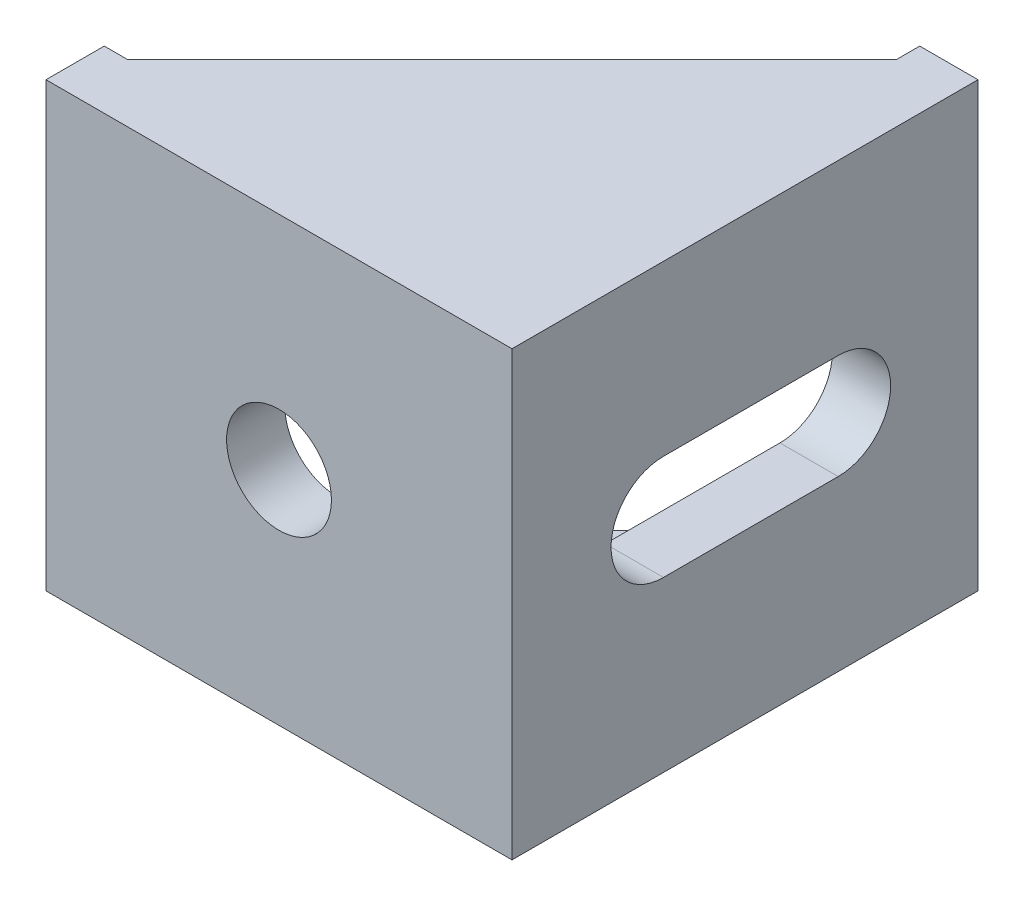
ISO-10303-21;
HEADER;
FILE_DESCRIPTION(('STEP AP214'),'2;1');
FILE_NAME('part.step','',(''),(''),'','','');
FILE_SCHEMA(('AUTOMOTIVE_DESIGN { 1 0 10303 214 1 1 1 1 }'));
ENDSEC;
DATA;
#1=APPLICATION_CONTEXT('core data for automotive mechanical design processes');
#2=APPLICATION_PROTOCOL_DEFINITION('international standard','automotive_design',2000,#1);
#3=PRODUCT_CONTEXT('',#1,'mechanical');
#4=PRODUCT('Part','Part','',(#3));
#5=PRODUCT_RELATED_PRODUCT_CATEGORY('part','',(#4));
#6=PRODUCT_DEFINITION_FORMATION('','',#4);
#7=PRODUCT_DEFINITION_CONTEXT('part definition',#1,'design');
#8=PRODUCT_DEFINITION('design','',#6,#7);
#9=PRODUCT_DEFINITION_SHAPE('','',#8);
#10=(LENGTH_UNIT() NAMED_UNIT(*) SI_UNIT(.MILLI.,.METRE.));
#11=(NAMED_UNIT(*) PLANE_ANGLE_UNIT() SI_UNIT($,.RADIAN.));
#12=(NAMED_UNIT(*) SI_UNIT($,.STERADIAN.) SOLID_ANGLE_UNIT());
#13=UNCERTAINTY_MEASURE_WITH_UNIT(LENGTH_MEASURE(1.E-05),#10,'distance_accuracy_value','');
#14=(GEOMETRIC_REPRESENTATION_CONTEXT(3) GLOBAL_UNCERTAINTY_ASSIGNED_CONTEXT((#13)) GLOBAL_UNIT_ASSIGNED_CONTEXT((#10,
#11,#12)) REPRESENTATION_CONTEXT('',''));
#15=CARTESIAN_POINT('',(0.,0.,0.));
#16=DIRECTION('',(0.,0.,1.));
#17=DIRECTION('',(1.,0.,0.));
#18=AXIS2_PLACEMENT_3D('',#15,#16,#17);
#19=CARTESIAN_POINT('',(-3.19189119579733E-13,18.999999999999,-5.00000000000089));
#20=DIRECTION('',(0.,0.,1.00000000000001));
#21=DIRECTION('',(1.,0.,0.));
#22=AXIS2_PLACEMENT_3D('',#19,#20,#21);
#23=PLANE('',#22);
#24=CARTESIAN_POINT('',(-19.9999999999997,-3.33066907387547E-13,-5.00000000000067));
#25=DIRECTION('',(0.,0.,1.00000000000001));
#26=DIRECTION('',(1.,0.,0.));
#27=AXIS2_PLACEMENT_3D('',#24,#25,#26);
#28=CIRCLE('',#27,4.5);
#29=CARTESIAN_POINT('',(-15.4999999999997,-3.32567307026466E-13,-5.00000000000067));
#30=VERTEX_POINT('',#29);
#31=EDGE_CURVE('E317',#30,#30,#28,.T.);
#32=ORIENTED_EDGE('',*,*,#31,.T.);
#33=EDGE_LOOP('',(#32));
#34=FACE_BOUND('',#33,.T.);
#35=DIRECTION('',(0.,-1.,0.));
#36=VECTOR('',#35,1.);
#37=CARTESIAN_POINT('',(-38.0000000000001,-16.,-5.00000000000001));
#38=LINE('',#37,#36);
#39=CARTESIAN_POINT('',(-38.0000000000001,-16.,-5.00000000000001));
#40=VERTEX_POINT('',#39);
#41=CARTESIAN_POINT('',(-38.0000000000011,-19.0000000000039,-5.00000000000401));
#42=VERTEX_POINT('',#41);
#43=EDGE_CURVE('E292',#40,#42,#38,.T.);
#44=ORIENTED_EDGE('',*,*,#43,.T.);
#45=DIRECTION('',(-1.,0.,0.));
#46=VECTOR('',#45,1.);
#47=CARTESIAN_POINT('',(-4.9960036108132E-13,-19.0000000000008,-5.00000000000024));
#48=LINE('',#47,#46);
#49=CARTESIAN_POINT('',(-40.,-19.0000000000002,-5.00000000000035));
#50=VERTEX_POINT('',#49);
#51=EDGE_CURVE('E233',#42,#50,#48,.T.);
#52=ORIENTED_EDGE('',*,*,#51,.T.);
#53=DIRECTION('',(0.,-1.,0.));
#54=VECTOR('',#53,1.);
#55=CARTESIAN_POINT('',(-40.0000000000002,18.9999999999991,-5.00000000000044));
#56=LINE('',#55,#54);
#57=CARTESIAN_POINT('',(-40.0000000000002,18.9999999999991,-5.00000000000044));
#58=VERTEX_POINT('',#57);
#59=EDGE_CURVE('E198',#58,#50,#56,.T.);
#60=ORIENTED_EDGE('',*,*,#59,.F.);
#61=DIRECTION('',(-1.,0.,0.));
#62=VECTOR('',#61,1.);
#63=CARTESIAN_POINT('',(-3.19189119579733E-13,18.999999999999,-5.00000000000089));
#64=LINE('',#63,#62);
#65=CARTESIAN_POINT('',(-38.0000000000012,18.999999999997,-5.00000000000044));
#66=VERTEX_POINT('',#65);
#67=EDGE_CURVE('E242',#66,#58,#64,.T.);
#68=ORIENTED_EDGE('',*,*,#67,.F.);
#69=DIRECTION('',(0.,1.,0.));
#70=VECTOR('',#69,1.);
#71=CARTESIAN_POINT('',(-38.000000000001,15.9999999999979,-5.00000000000089));
#72=LINE('',#71,#70);
#73=CARTESIAN_POINT('',(-38.000000000001,15.9999999999979,-5.00000000000089));
#74=VERTEX_POINT('',#73);
#75=EDGE_CURVE('E167',#74,#66,#72,.T.);
#76=ORIENTED_EDGE('',*,*,#75,.F.);
#77=DIRECTION('',(1.,0.,0.));
#78=VECTOR('',#77,1.);
#79=CARTESIAN_POINT('',(-38.000000000001,15.9999999999979,-5.00000000000089));
#80=LINE('',#79,#78);
#81=CARTESIAN_POINT('',(-5.00000000000028,15.9999999999983,-4.99999999999978));
#82=VERTEX_POINT('',#81);
#83=EDGE_CURVE('E156',#74,#82,#80,.T.);
#84=ORIENTED_EDGE('',*,*,#83,.T.);
#85=DIRECTION('',(0.,-1.,0.));
#86=VECTOR('',#85,1.);
#87=CARTESIAN_POINT('',(-4.99999999999998,18.999999999999,-5.00000000000055));
#88=LINE('',#87,#86);
#89=CARTESIAN_POINT('',(-5.00000000000005,-16.0000000000001,-5.00000000000012));
#90=VERTEX_POINT('',#89);
#91=EDGE_CURVE('E163',#82,#90,#88,.T.);
#92=ORIENTED_EDGE('',*,*,#91,.T.);
#93=DIRECTION('',(1.,0.,0.));
#94=VECTOR('',#93,1.);
#95=CARTESIAN_POINT('',(-38.0000000000001,-16.,-5.00000000000001));
#96=LINE('',#95,#94);
#97=EDGE_CURVE('E68',#40,#90,#96,.T.);
#98=ORIENTED_EDGE('',*,*,#97,.F.);
#99=EDGE_LOOP('',(#44,#52,#60,#68,#76,#84,#92,#98));
#100=FACE_BOUND('',#99,.T.);
#101=ADVANCED_FACE('F51',(#34,#100),#23,.F.);
#102=CARTESIAN_POINT('',(-5.00000000000014,18.9999999999993,-4.37150315946155E-13));
#103=DIRECTION('',(1.,0.,0.));
#104=DIRECTION('',(0.,0.,-1.00000000000001));
#105=AXIS2_PLACEMENT_3D('',#102,#103,#104);
#106=PLANE('',#105);
#107=DIRECTION('',(0.,0.,1.00000000000001));
#108=VECTOR('',#107,1.);
#109=CARTESIAN_POINT('',(-5.00000000000123,4.49999999999706,-7.73686670285656E-13));
#110=LINE('',#109,#108);
#111=CARTESIAN_POINT('',(-5.0000000000006,4.49999999999684,-28.0000000000037));
#112=VERTEX_POINT('',#111);
#113=CARTESIAN_POINT('',(-4.99999999999995,4.50000000000006,-13.));
#114=VERTEX_POINT('',#113);
#115=EDGE_CURVE('E56',#112,#114,#110,.T.);
#116=ORIENTED_EDGE('',*,*,#115,.T.);
#117=CARTESIAN_POINT('',(-5.0000000000004,-1.66533453693773E-12,-13.0000000000017));
#118=DIRECTION('',(1.,0.,0.));
#119=DIRECTION('',(0.,0.,-1.00000000000001));
#120=AXIS2_PLACEMENT_3D('',#117,#118,#119);
#121=CIRCLE('',#120,4.5);
#122=CARTESIAN_POINT('',(-5.00000000000005,-4.50000000000095,-13.0000000000002));
#123=VERTEX_POINT('',#122);
#124=EDGE_CURVE('E11',#114,#123,#121,.T.);
#125=ORIENTED_EDGE('',*,*,#124,.T.);
#126=DIRECTION('',(0.,0.,-1.00000000000001));
#127=VECTOR('',#126,1.);
#128=CARTESIAN_POINT('',(-5.00000000000006,-4.50000000000061,-1.14491749414469E-13));
#129=LINE('',#128,#127);
#130=CARTESIAN_POINT('',(-4.99999999999987,-4.50000000000295,-28.0000000000025));
#131=VERTEX_POINT('',#130);
#132=EDGE_CURVE('E199',#123,#131,#129,.T.);
#133=ORIENTED_EDGE('',*,*,#132,.T.);
#134=CARTESIAN_POINT('',(-4.99999999999985,-9.99200722162641E-13,-28.0000000000005));
#135=DIRECTION('',(1.,0.,0.));
#136=DIRECTION('',(0.,0.,-1.00000000000001));
#137=AXIS2_PLACEMENT_3D('',#134,#135,#136);
#138=CIRCLE('',#137,4.5);
#139=EDGE_CURVE('E204',#131,#112,#138,.T.);
#140=ORIENTED_EDGE('',*,*,#139,.T.);
#141=EDGE_LOOP('',(#116,#125,#133,#140));
#142=FACE_BOUND('',#141,.T.);
#143=DIRECTION('',(0.,-1.,0.));
#144=VECTOR('',#143,1.);
#145=CARTESIAN_POINT('',(-5.00000000000072,-16.000000000002,-38.0000000000022));
#146=LINE('',#145,#144);
#147=CARTESIAN_POINT('',(-5.00000000000072,-16.000000000002,-38.0000000000022));
#148=VERTEX_POINT('',#147);
#149=CARTESIAN_POINT('',(-5.00000000000008,-19.0000000000003,-38.0000000000001));
#150=VERTEX_POINT('',#149);
#151=EDGE_CURVE('E74',#148,#150,#146,.T.);
#152=ORIENTED_EDGE('',*,*,#151,.F.);
#153=DIRECTION('',(0.,0.,-1.00000000000001));
#154=VECTOR('',#153,1.);
#155=CARTESIAN_POINT('',(-5.00000000000005,-16.0000000000001,-5.00000000000012));
#156=LINE('',#155,#154);
#157=EDGE_CURVE('E172',#90,#148,#156,.T.);
#158=ORIENTED_EDGE('',*,*,#157,.F.);
#159=ORIENTED_EDGE('',*,*,#91,.F.);
#160=DIRECTION('',(0.,0.,-1.00000000000001));
#161=VECTOR('',#160,1.);
#162=CARTESIAN_POINT('',(-5.00000000000028,15.9999999999983,-4.99999999999978));
#163=LINE('',#162,#161);
#164=CARTESIAN_POINT('',(-5.00000000000007,15.9999999999995,-38.));
#165=VERTEX_POINT('',#164);
#166=EDGE_CURVE('E153',#82,#165,#163,.T.);
#167=ORIENTED_EDGE('',*,*,#166,.T.);
#168=DIRECTION('',(0.,1.,0.));
#169=VECTOR('',#168,1.);
#170=CARTESIAN_POINT('',(-5.00000000000007,15.9999999999995,-38.));
#171=LINE('',#170,#169);
#172=CARTESIAN_POINT('',(-4.99999999999994,18.9999999999991,-38.));
#173=VERTEX_POINT('',#172);
#174=EDGE_CURVE('E307',#165,#173,#171,.T.);
#175=ORIENTED_EDGE('',*,*,#174,.T.);
#176=DIRECTION('',(0.,0.,-1.00000000000001));
#177=VECTOR('',#176,1.);
#178=CARTESIAN_POINT('',(-5.00000000000014,18.9999999999993,-4.37150315946155E-13));
#179=LINE('',#178,#177);
#180=CARTESIAN_POINT('',(-5.00000000000007,18.9999999999998,-39.9999999999999));
#181=VERTEX_POINT('',#180);
#182=EDGE_CURVE('E171',#181,#173,#179,.F.);
#183=ORIENTED_EDGE('',*,*,#182,.F.);
#184=DIRECTION('',(0.,-1.,0.));
#185=VECTOR('',#184,1.);
#186=CARTESIAN_POINT('',(-5.00000000000007,18.9999999999998,-39.9999999999999));
#187=LINE('',#186,#185);
#188=CARTESIAN_POINT('',(-5.00000000000043,-19.0000000000039,-40.0000000000034));
#189=VERTEX_POINT('',#188);
#190=EDGE_CURVE('E174',#181,#189,#187,.T.);
#191=ORIENTED_EDGE('',*,*,#190,.T.);
#192=DIRECTION('',(0.,0.,-1.00000000000001));
#193=VECTOR('',#192,1.);
#194=CARTESIAN_POINT('',(-5.00000000000016,-19.0000000000002,-4.5102810375397E-13));
#195=LINE('',#194,#193);
#196=EDGE_CURVE('E183',#189,#150,#195,.F.);
#197=ORIENTED_EDGE('',*,*,#196,.T.);
#198=EDGE_LOOP('',(#152,#158,#159,#167,#175,#183,#191,#197));
#199=FACE_BOUND('',#198,.T.);
#200=ADVANCED_FACE('F168',(#142,#199),#106,.F.);
#201=CARTESIAN_POINT('',(-40.0000000000016,18.9999999999966,-2.54657406273395E-12));
#202=DIRECTION('',(-1.,0.,0.));
#203=DIRECTION('',(0.,0.,1.00000000000001));
#204=AXIS2_PLACEMENT_3D('',#201,#202,#203);
#205=PLANE('',#204);
#206=DIRECTION('',(0.,0.,-1.00000000000001));
#207=VECTOR('',#206,1.);
#208=CARTESIAN_POINT('',(-40.0000000000006,-19.0000000000001,-3.40005801291454E-13));
#209=LINE('',#208,#207);
#210=CARTESIAN_POINT('',(-40.0000000000006,-19.0000000000001,-3.40005801291454E-13));
#211=VERTEX_POINT('',#210);
#212=EDGE_CURVE('E261',#211,#50,#209,.T.);
#213=ORIENTED_EDGE('',*,*,#212,.F.);
#214=DIRECTION('',(0.,-1.,0.));
#215=VECTOR('',#214,1.);
#216=CARTESIAN_POINT('',(-40.0000000000016,18.9999999999966,-2.54657406273395E-12));
#217=LINE('',#216,#215);
#218=CARTESIAN_POINT('',(-40.0000000000016,18.9999999999966,-2.54657406273395E-12));
#219=VERTEX_POINT('',#218);
#220=EDGE_CURVE('E191',#219,#211,#217,.T.);
#221=ORIENTED_EDGE('',*,*,#220,.F.);
#222=DIRECTION('',(0.,0.,-1.00000000000001));
#223=VECTOR('',#222,1.);
#224=CARTESIAN_POINT('',(-40.0000000000016,18.9999999999966,-2.54657406273395E-12));
#225=LINE('',#224,#223);
#226=EDGE_CURVE('E241',#219,#58,#225,.T.);
#227=ORIENTED_EDGE('',*,*,#226,.T.);
#228=ORIENTED_EDGE('',*,*,#59,.T.);
#229=EDGE_LOOP('',(#213,#221,#227,#228));
#230=FACE_BOUND('',#229,.T.);
#231=ADVANCED_FACE('F357',(#230),#205,.T.);
#232=CARTESIAN_POINT('',(-6.80011602582908E-13,18.9999999999971,-1.32532873564628E-12));
#233=DIRECTION('',(0.,0.,1.00000000000001));
#234=DIRECTION('',(1.,0.,0.));
#235=AXIS2_PLACEMENT_3D('',#232,#233,#234);
#236=PLANE('',#235);
#237=CARTESIAN_POINT('',(-20.,-2.22044604925031E-13,-2.25514051876985E-13));
#238=DIRECTION('',(0.,0.,1.00000000000001));
#239=DIRECTION('',(1.,0.,0.));
#240=AXIS2_PLACEMENT_3D('',#237,#238,#239);
#241=CIRCLE('',#240,4.5);
#242=CARTESIAN_POINT('',(-15.5,-2.21045404202869E-13,-2.25763852057526E-13));
#243=VERTEX_POINT('',#242);
#244=EDGE_CURVE('E311',#243,#243,#241,.T.);
#245=ORIENTED_EDGE('',*,*,#244,.F.);
#246=EDGE_LOOP('',(#245));
#247=FACE_BOUND('',#246,.T.);
#248=DIRECTION('',(-1.,0.,0.));
#249=VECTOR('',#248,1.);
#250=CARTESIAN_POINT('',(0.,-19.,-2.28983498828939E-13));
#251=LINE('',#250,#249);
#252=CARTESIAN_POINT('',(0.,-19.,-2.28983498828939E-13));
#253=VERTEX_POINT('',#252);
#254=EDGE_CURVE('E264',#253,#211,#251,.T.);
#255=ORIENTED_EDGE('',*,*,#254,.F.);
#256=DIRECTION('',(0.,-1.,0.));
#257=VECTOR('',#256,1.);
#258=CARTESIAN_POINT('',(-6.80011602582908E-13,18.9999999999971,-1.32532873564628E-12));
#259=LINE('',#258,#257);
#260=CARTESIAN_POINT('',(-6.80011602582908E-13,18.9999999999971,-1.32532873564628E-12));
#261=VERTEX_POINT('',#260);
#262=EDGE_CURVE('E188',#261,#253,#259,.T.);
#263=ORIENTED_EDGE('',*,*,#262,.F.);
#264=DIRECTION('',(-1.,0.,0.));
#265=VECTOR('',#264,1.);
#266=CARTESIAN_POINT('',(-6.80011602582908E-13,18.9999999999971,-1.32532873564628E-12));
#267=LINE('',#266,#265);
#268=EDGE_CURVE('E246',#261,#219,#267,.T.);
#269=ORIENTED_EDGE('',*,*,#268,.T.);
#270=ORIENTED_EDGE('',*,*,#220,.T.);
#271=EDGE_LOOP('',(#255,#263,#269,#270));
#272=FACE_BOUND('',#271,.T.);
#273=ADVANCED_FACE('F370',(#247,#272),#236,.T.);
#274=CARTESIAN_POINT('',(-6.80011602582908E-13,18.9999999999971,-1.32532873564628E-12));
#275=DIRECTION('',(1.,0.,0.));
#276=DIRECTION('',(0.,0.,-1.00000000000001));
#277=AXIS2_PLACEMENT_3D('',#274,#275,#276);
#278=PLANE('',#277);
#279=CARTESIAN_POINT('',(-2.67147415300428E-13,-2.1094237467878E-12,-13.0000000000008));
#280=DIRECTION('',(1.,0.,0.));
#281=DIRECTION('',(0.,0.,-1.00000000000001));
#282=AXIS2_PLACEMENT_3D('',#279,#280,#281);
#283=CIRCLE('',#282,4.5);
#284=CARTESIAN_POINT('',(-4.47558656802016E-13,4.49999999999962,-13.0000000000007));
#285=VERTEX_POINT('',#284);
#286=CARTESIAN_POINT('',(0.,-4.50000000000028,-12.9999999999999));
#287=VERTEX_POINT('',#286);
#288=EDGE_CURVE('E323',#285,#287,#283,.T.);
#289=ORIENTED_EDGE('',*,*,#288,.F.);
#290=DIRECTION('',(0.,0.,1.00000000000001));
#291=VECTOR('',#290,1.);
#292=CARTESIAN_POINT('',(-4.47558656802016E-13,4.49999999999962,-13.0000000000007));
#293=LINE('',#292,#291);
#294=CARTESIAN_POINT('',(-1.52655665885959E-13,4.49999999999851,-28.0000000000003));
#295=VERTEX_POINT('',#294);
#296=EDGE_CURVE('E238',#295,#285,#293,.T.);
#297=ORIENTED_EDGE('',*,*,#296,.F.);
#298=CARTESIAN_POINT('',(-4.16333634234434E-13,-9.99200722162641E-13,-28.0000000000006));
#299=DIRECTION('',(1.,0.,0.));
#300=DIRECTION('',(0.,0.,-1.00000000000001));
#301=AXIS2_PLACEMENT_3D('',#298,#299,#300);
#302=CIRCLE('',#301,4.5);
#303=CARTESIAN_POINT('',(-6.66133814775094E-13,-4.50000000000184,-28.0000000000008));
#304=VERTEX_POINT('',#303);
#305=EDGE_CURVE('E224',#304,#295,#302,.T.);
#306=ORIENTED_EDGE('',*,*,#305,.F.);
#307=DIRECTION('',(0.,0.,-1.00000000000001));
#308=VECTOR('',#307,1.);
#309=CARTESIAN_POINT('',(0.,-4.50000000000028,-12.9999999999999));
#310=LINE('',#309,#308);
#311=EDGE_CURVE('E326',#287,#304,#310,.T.);
#312=ORIENTED_EDGE('',*,*,#311,.F.);
#313=EDGE_LOOP('',(#289,#297,#306,#312));
#314=FACE_BOUND('',#313,.T.);
#315=DIRECTION('',(0.,0.,1.00000000000001));
#316=VECTOR('',#315,1.);
#317=CARTESIAN_POINT('',(0.,-19.,-2.28983498828939E-13));
#318=LINE('',#317,#316);
#319=CARTESIAN_POINT('',(-4.19803081186387E-13,-19.0000000000033,-40.0000000000028));
#320=VERTEX_POINT('',#319);
#321=EDGE_CURVE('E267',#320,#253,#318,.T.);
#322=ORIENTED_EDGE('',*,*,#321,.F.);
#323=DIRECTION('',(0.,-1.,0.));
#324=VECTOR('',#323,1.);
#325=CARTESIAN_POINT('',(-1.70002900645727E-13,18.9999999999993,-40.0000000000007));
#326=LINE('',#325,#324);
#327=CARTESIAN_POINT('',(-1.70002900645727E-13,18.9999999999993,-40.0000000000007));
#328=VERTEX_POINT('',#327);
#329=EDGE_CURVE('E179',#328,#320,#326,.T.);
#330=ORIENTED_EDGE('',*,*,#329,.F.);
#331=DIRECTION('',(0.,0.,1.00000000000001));
#332=VECTOR('',#331,1.);
#333=CARTESIAN_POINT('',(-6.80011602582908E-13,18.9999999999971,-1.32532873564628E-12));
#334=LINE('',#333,#332);
#335=EDGE_CURVE('E252',#328,#261,#334,.T.);
#336=ORIENTED_EDGE('',*,*,#335,.T.);
#337=ORIENTED_EDGE('',*,*,#262,.T.);
#338=EDGE_LOOP('',(#322,#330,#336,#337));
#339=FACE_BOUND('',#338,.T.);
#340=ADVANCED_FACE('F337',(#314,#339),#278,.T.);
#341=CARTESIAN_POINT('',(-5.00000000000007,18.9999999999998,-39.9999999999999));
#342=DIRECTION('',(0.,0.,-1.00000000000001));
#343=DIRECTION('',(-1.,0.,0.));
#344=AXIS2_PLACEMENT_3D('',#341,#342,#343);
#345=PLANE('',#344);
#346=DIRECTION('',(1.,0.,0.));
#347=VECTOR('',#346,1.);
#348=CARTESIAN_POINT('',(-5.00000000000043,-19.0000000000039,-40.0000000000034));
#349=LINE('',#348,#347);
#350=EDGE_CURVE('E275',#189,#320,#349,.T.);
#351=ORIENTED_EDGE('',*,*,#350,.F.);
#352=ORIENTED_EDGE('',*,*,#190,.F.);
#353=DIRECTION('',(1.,0.,0.));
#354=VECTOR('',#353,1.);
#355=CARTESIAN_POINT('',(-5.00000000000007,18.9999999999998,-39.9999999999999));
#356=LINE('',#355,#354);
#357=EDGE_CURVE('E185',#181,#328,#356,.T.);
#358=ORIENTED_EDGE('',*,*,#357,.T.);
#359=ORIENTED_EDGE('',*,*,#329,.T.);
#360=EDGE_LOOP('',(#351,#352,#358,#359));
#361=FACE_BOUND('',#360,.T.);
#362=ADVANCED_FACE('F375',(#361),#345,.T.);
#363=CARTESIAN_POINT('',(-6.80011602582908E-13,18.9999999999971,-1.32532873564628E-12));
#364=DIRECTION('',(0.,-1.,0.));
#365=DIRECTION('',(-1.,0.,0.));
#366=AXIS2_PLACEMENT_3D('',#363,#364,#365);
#367=PLANE('',#366);
#368=DIRECTION('',(-0.707106781186553,0.,0.707106781186564));
#369=VECTOR('',#368,1.);
#370=CARTESIAN_POINT('',(-38.0000000000012,18.999999999997,-5.00000000000044));
#371=LINE('',#370,#369);
#372=EDGE_CURVE('E169',#173,#66,#371,.T.);
#373=ORIENTED_EDGE('',*,*,#372,.T.);
#374=ORIENTED_EDGE('',*,*,#67,.T.);
#375=ORIENTED_EDGE('',*,*,#226,.F.);
#376=ORIENTED_EDGE('',*,*,#268,.F.);
#377=ORIENTED_EDGE('',*,*,#335,.F.);
#378=ORIENTED_EDGE('',*,*,#357,.F.);
#379=ORIENTED_EDGE('',*,*,#182,.T.);
#380=EDGE_LOOP('',(#373,#374,#375,#376,#377,#378,#379));
#381=FACE_BOUND('',#380,.T.);
#382=ADVANCED_FACE('F374',(#381),#367,.F.);
#383=CARTESIAN_POINT('',(0.,-19.,-2.28983498828939E-13));
#384=DIRECTION('',(0.,-1.,0.));
#385=DIRECTION('',(-1.,0.,0.));
#386=AXIS2_PLACEMENT_3D('',#383,#384,#385);
#387=PLANE('',#386);
#388=ORIENTED_EDGE('',*,*,#51,.F.);
#389=DIRECTION('',(-0.707106781186553,0.,0.707106781186564));
#390=VECTOR('',#389,1.);
#391=CARTESIAN_POINT('',(-38.0000000000011,-19.0000000000039,-5.00000000000401));
#392=LINE('',#391,#390);
#393=EDGE_CURVE('E286',#150,#42,#392,.T.);
#394=ORIENTED_EDGE('',*,*,#393,.F.);
#395=ORIENTED_EDGE('',*,*,#196,.F.);
#396=ORIENTED_EDGE('',*,*,#350,.T.);
#397=ORIENTED_EDGE('',*,*,#321,.T.);
#398=ORIENTED_EDGE('',*,*,#254,.T.);
#399=ORIENTED_EDGE('',*,*,#212,.T.);
#400=EDGE_LOOP('',(#388,#394,#395,#396,#397,#398,#399));
#401=FACE_BOUND('',#400,.T.);
#402=ADVANCED_FACE('F294',(#401),#387,.T.);
#403=CARTESIAN_POINT('',(-40.0000000000001,-6.66133814775094E-13,-13.0000000000006));
#404=DIRECTION('',(1.,0.,0.));
#405=DIRECTION('',(0.,0.,-1.00000000000001));
#406=AXIS2_PLACEMENT_3D('',#403,#404,#405);
#407=CYLINDRICAL_SURFACE('',#406,4.5);
#408=DIRECTION('',(1.,0.,0.));
#409=VECTOR('',#408,1.);
#410=CARTESIAN_POINT('',(-40.0000000000007,4.49999999999662,-13.000000000002));
#411=LINE('',#410,#409);
#412=EDGE_CURVE('E218',#114,#285,#411,.T.);
#413=ORIENTED_EDGE('',*,*,#412,.T.);
#414=ORIENTED_EDGE('',*,*,#288,.T.);
#415=DIRECTION('',(1.,0.,0.));
#416=VECTOR('',#415,1.);
#417=CARTESIAN_POINT('',(-40.0000000000012,-4.50000000000339,-13.0000000000028));
#418=LINE('',#417,#416);
#419=EDGE_CURVE('E231',#123,#287,#418,.T.);
#420=ORIENTED_EDGE('',*,*,#419,.F.);
#421=ORIENTED_EDGE('',*,*,#124,.F.);
#422=EDGE_LOOP('',(#413,#414,#420,#421));
#423=FACE_BOUND('',#422,.T.);
#424=ADVANCED_FACE('F338',(#423),#407,.F.);
#425=CARTESIAN_POINT('',(-40.0000000000007,4.49999999999662,-13.000000000002));
#426=DIRECTION('',(0.,1.,0.));
#427=DIRECTION('',(0.,0.,1.00000000000001));
#428=AXIS2_PLACEMENT_3D('',#425,#426,#427);
#429=PLANE('',#428);
#430=DIRECTION('',(1.,0.,0.));
#431=VECTOR('',#430,1.);
#432=CARTESIAN_POINT('',(-40.0000000000003,4.49999999999939,-28.0000000000006));
#433=LINE('',#432,#431);
#434=EDGE_CURVE('E220',#112,#295,#433,.T.);
#435=ORIENTED_EDGE('',*,*,#434,.T.);
#436=ORIENTED_EDGE('',*,*,#296,.T.);
#437=ORIENTED_EDGE('',*,*,#412,.F.);
#438=ORIENTED_EDGE('',*,*,#115,.F.);
#439=EDGE_LOOP('',(#435,#436,#437,#438));
#440=FACE_BOUND('',#439,.T.);
#441=ADVANCED_FACE('F214',(#440),#429,.F.);
#442=CARTESIAN_POINT('',(-40.0000000000005,-1.33226762955019E-12,-28.0000000000013));
#443=DIRECTION('',(1.,0.,0.));
#444=DIRECTION('',(0.,0.,-1.00000000000001));
#445=AXIS2_PLACEMENT_3D('',#442,#443,#444);
#446=CYLINDRICAL_SURFACE('',#445,4.5);
#447=DIRECTION('',(1.,0.,0.));
#448=VECTOR('',#447,1.);
#449=CARTESIAN_POINT('',(-40.0000000000002,-4.5000000000005,-28.0000000000009));
#450=LINE('',#449,#448);
#451=EDGE_CURVE('E227',#131,#304,#450,.T.);
#452=ORIENTED_EDGE('',*,*,#451,.T.);
#453=ORIENTED_EDGE('',*,*,#305,.T.);
#454=ORIENTED_EDGE('',*,*,#434,.F.);
#455=ORIENTED_EDGE('',*,*,#139,.F.);
#456=EDGE_LOOP('',(#452,#453,#454,#455));
#457=FACE_BOUND('',#456,.T.);
#458=ADVANCED_FACE('F222',(#457),#446,.F.);
#459=CARTESIAN_POINT('',(-40.0000000000012,-4.50000000000339,-13.0000000000028));
#460=DIRECTION('',(0.,-1.,0.));
#461=DIRECTION('',(0.,0.,-1.00000000000001));
#462=AXIS2_PLACEMENT_3D('',#459,#460,#461);
#463=PLANE('',#462);
#464=ORIENTED_EDGE('',*,*,#419,.T.);
#465=ORIENTED_EDGE('',*,*,#311,.T.);
#466=ORIENTED_EDGE('',*,*,#451,.F.);
#467=ORIENTED_EDGE('',*,*,#132,.F.);
#468=EDGE_LOOP('',(#464,#465,#466,#467));
#469=FACE_BOUND('',#468,.T.);
#470=ADVANCED_FACE('F345',(#469),#463,.F.);
#471=CARTESIAN_POINT('',(-20.0000000000009,-2.77555756156289E-12,-40.0000000000023));
#472=DIRECTION('',(0.,0.,1.00000000000001));
#473=DIRECTION('',(1.,0.,0.));
#474=AXIS2_PLACEMENT_3D('',#471,#472,#473);
#475=CYLINDRICAL_SURFACE('',#474,4.5);
#476=ORIENTED_EDGE('',*,*,#244,.T.);
#477=EDGE_LOOP('',(#476));
#478=FACE_BOUND('',#477,.T.);
#479=ORIENTED_EDGE('',*,*,#31,.F.);
#480=EDGE_LOOP('',(#479));
#481=FACE_BOUND('',#480,.T.);
#482=ADVANCED_FACE('F344',(#478,#481),#475,.F.);
#483=CARTESIAN_POINT('',(-38.000000000001,15.9999999999979,-5.00000000000089));
#484=DIRECTION('',(-0.707106781186548,0.,-0.707106781186559));
#485=DIRECTION('',(-0.707106781186553,0.,0.707106781186562));
#486=AXIS2_PLACEMENT_3D('',#483,#484,#485);
#487=PLANE('',#486);
#488=ORIENTED_EDGE('',*,*,#372,.F.);
#489=ORIENTED_EDGE('',*,*,#174,.F.);
#490=DIRECTION('',(-0.707106781186553,0.,0.707106781186564));
#491=VECTOR('',#490,1.);
#492=CARTESIAN_POINT('',(-38.000000000001,15.9999999999979,-5.00000000000089));
#493=LINE('',#492,#491);
#494=EDGE_CURVE('E158',#165,#74,#493,.T.);
#495=ORIENTED_EDGE('',*,*,#494,.T.);
#496=ORIENTED_EDGE('',*,*,#75,.T.);
#497=EDGE_LOOP('',(#488,#489,#495,#496));
#498=FACE_BOUND('',#497,.T.);
#499=ADVANCED_FACE('F348',(#498),#487,.T.);
#500=CARTESIAN_POINT('',(-4.30211422042248E-13,15.9999999999965,-1.21430643318376E-12));
#501=DIRECTION('',(0.,1.,0.));
#502=DIRECTION('',(0.,0.,1.00000000000001));
#503=AXIS2_PLACEMENT_3D('',#500,#501,#502);
#504=PLANE('',#503);
#505=ORIENTED_EDGE('',*,*,#83,.F.);
#506=ORIENTED_EDGE('',*,*,#494,.F.);
#507=ORIENTED_EDGE('',*,*,#166,.F.);
#508=EDGE_LOOP('',(#505,#506,#507));
#509=FACE_BOUND('',#508,.T.);
#510=ADVANCED_FACE('F154',(#509),#504,.F.);
#511=CARTESIAN_POINT('',(-38.0000000000001,-16.,-5.00000000000001));
#512=DIRECTION('',(0.707106781186548,0.,0.707106781186559));
#513=DIRECTION('',(0.707106781186553,0.,-0.707106781186562));
#514=AXIS2_PLACEMENT_3D('',#511,#512,#513);
#515=PLANE('',#514);
#516=ORIENTED_EDGE('',*,*,#393,.T.);
#517=ORIENTED_EDGE('',*,*,#43,.F.);
#518=DIRECTION('',(-0.707106781186553,0.,0.707106781186564));
#519=VECTOR('',#518,1.);
#520=CARTESIAN_POINT('',(-38.0000000000001,-16.,-5.00000000000001));
#521=LINE('',#520,#519);
#522=EDGE_CURVE('E289',#148,#40,#521,.T.);
#523=ORIENTED_EDGE('',*,*,#522,.F.);
#524=ORIENTED_EDGE('',*,*,#151,.T.);
#525=EDGE_LOOP('',(#516,#517,#523,#524));
#526=FACE_BOUND('',#525,.T.);
#527=ADVANCED_FACE('F288',(#526),#515,.F.);
#528=CARTESIAN_POINT('',(-1.11022302462516E-13,-16.0000000000002,-3.40005801291454E-13));
#529=DIRECTION('',(0.,-1.,0.));
#530=DIRECTION('',(0.,0.,1.00000000000001));
#531=AXIS2_PLACEMENT_3D('',#528,#529,#530);
#532=PLANE('',#531);
#533=ORIENTED_EDGE('',*,*,#97,.T.);
#534=ORIENTED_EDGE('',*,*,#157,.T.);
#535=ORIENTED_EDGE('',*,*,#522,.T.);
#536=EDGE_LOOP('',(#533,#534,#535));
#537=FACE_BOUND('',#536,.T.);
#538=ADVANCED_FACE('F463',(#537),#532,.F.);
#539=CLOSED_SHELL('',(#101,#200,#231,#273,#340,#362,#382,#402,#424,#441,#458,#470,#482,#499,
#510,#527,#538));
#540=MANIFOLD_SOLID_BREP('B2',#539);
#541=ADVANCED_BREP_SHAPE_REPRESENTATION('',(#18,#540),#14);
#542=SHAPE_DEFINITION_REPRESENTATION(#9,#541);
ENDSEC;
END-ISO-10303-21;
